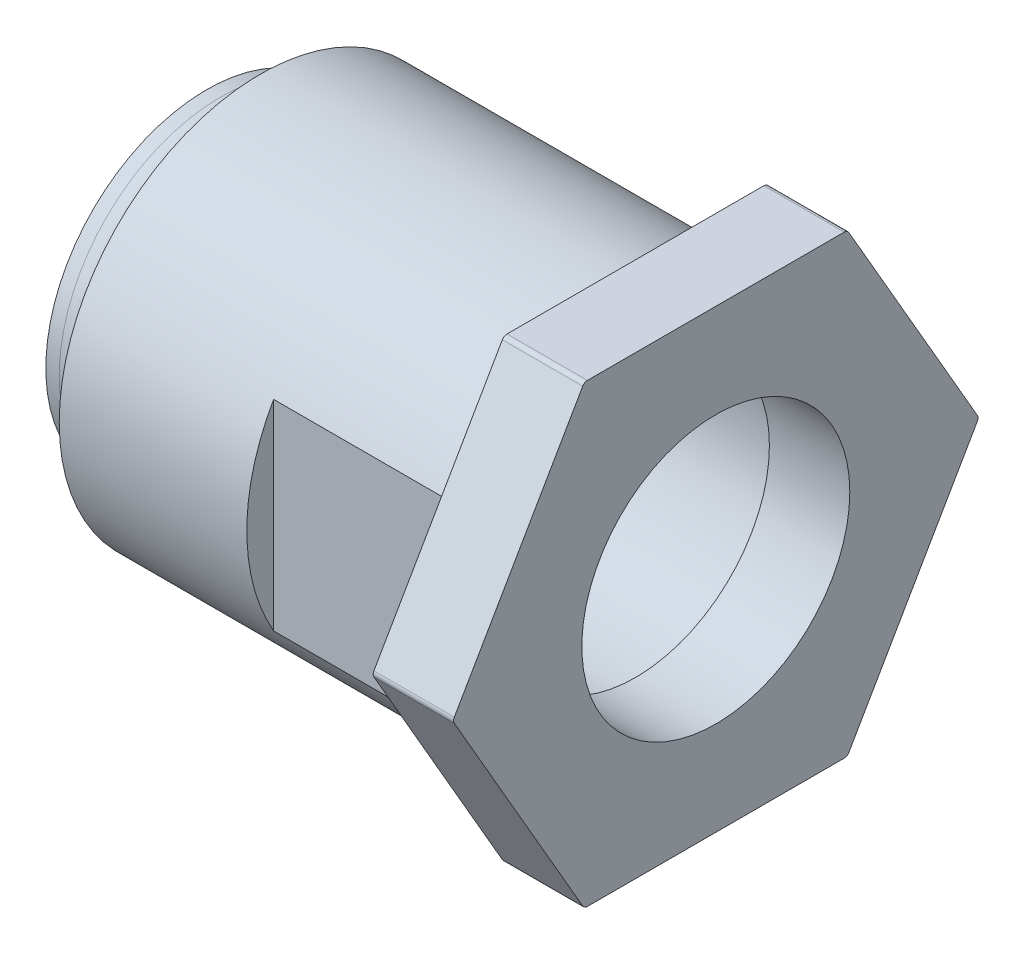
ISO-10303-21;
HEADER;
FILE_DESCRIPTION(('STEP AP214'),'2;1');
FILE_NAME('part.step','',(''),(''),'','','');
FILE_SCHEMA(('AUTOMOTIVE_DESIGN { 1 0 10303 214 1 1 1 1 }'));
ENDSEC;
DATA;
#1=APPLICATION_CONTEXT('core data for automotive mechanical design processes');
#2=APPLICATION_PROTOCOL_DEFINITION('international standard','automotive_design',2000,#1);
#3=PRODUCT_CONTEXT('',#1,'mechanical');
#4=PRODUCT('Part','Part','',(#3));
#5=PRODUCT_RELATED_PRODUCT_CATEGORY('part','',(#4));
#6=PRODUCT_DEFINITION_FORMATION('','',#4);
#7=PRODUCT_DEFINITION_CONTEXT('part definition',#1,'design');
#8=PRODUCT_DEFINITION('design','',#6,#7);
#9=PRODUCT_DEFINITION_SHAPE('','',#8);
#10=(LENGTH_UNIT() NAMED_UNIT(*) SI_UNIT(.MILLI.,.METRE.));
#11=(NAMED_UNIT(*) PLANE_ANGLE_UNIT() SI_UNIT($,.RADIAN.));
#12=(NAMED_UNIT(*) SI_UNIT($,.STERADIAN.) SOLID_ANGLE_UNIT());
#13=UNCERTAINTY_MEASURE_WITH_UNIT(LENGTH_MEASURE(1.E-05),#10,'distance_accuracy_value','');
#14=(GEOMETRIC_REPRESENTATION_CONTEXT(3) GLOBAL_UNCERTAINTY_ASSIGNED_CONTEXT((#13)) GLOBAL_UNIT_ASSIGNED_CONTEXT((#10,
#11,#12)) REPRESENTATION_CONTEXT('',''));
#15=CARTESIAN_POINT('',(0.,0.,0.));
#16=DIRECTION('',(0.,0.,1.));
#17=DIRECTION('',(1.,0.,0.));
#18=AXIS2_PLACEMENT_3D('',#15,#16,#17);
#19=CARTESIAN_POINT('',(0.,0.,0.));
#20=DIRECTION('',(1.,0.,0.));
#21=DIRECTION('',(0.,0.,-1.));
#22=AXIS2_PLACEMENT_3D('',#19,#20,#21);
#23=CYLINDRICAL_SURFACE('',#22,7.5);
#24=CARTESIAN_POINT('',(-14.,0.,0.));
#25=DIRECTION('',(1.,0.,0.));
#26=DIRECTION('',(0.,0.,-1.));
#27=AXIS2_PLACEMENT_3D('',#24,#25,#26);
#28=CIRCLE('',#27,7.5);
#29=CARTESIAN_POINT('',(-14.,0.,-7.5));
#30=VERTEX_POINT('',#29);
#31=EDGE_CURVE('E169',#30,#30,#28,.T.);
#32=ORIENTED_EDGE('',*,*,#31,.T.);
#33=EDGE_LOOP('',(#32));
#34=FACE_BOUND('',#33,.T.);
#35=CARTESIAN_POINT('',(0.,0.,0.));
#36=DIRECTION('',(1.,0.,0.));
#37=DIRECTION('',(0.,0.,-1.));
#38=AXIS2_PLACEMENT_3D('',#35,#36,#37);
#39=CIRCLE('',#38,7.5);
#40=CARTESIAN_POINT('',(0.,3.74165738677394,-6.5));
#41=VERTEX_POINT('',#40);
#42=CARTESIAN_POINT('',(0.,3.74165738677394,6.5));
#43=VERTEX_POINT('',#42);
#44=EDGE_CURVE('E168',#41,#43,#39,.T.);
#45=ORIENTED_EDGE('',*,*,#44,.F.);
#46=DIRECTION('',(1.,0.,0.));
#47=VECTOR('',#46,1.);
#48=CARTESIAN_POINT('',(0.,3.74165738677394,-6.5));
#49=LINE('',#48,#47);
#50=CARTESIAN_POINT('',(-7.,3.74165738677394,-6.5));
#51=VERTEX_POINT('',#50);
#52=EDGE_CURVE('E210',#41,#51,#49,.F.);
#53=ORIENTED_EDGE('',*,*,#52,.T.);
#54=CARTESIAN_POINT('',(-7.,0.,0.));
#55=DIRECTION('',(1.,0.,0.));
#56=DIRECTION('',(0.,0.,-1.));
#57=AXIS2_PLACEMENT_3D('',#54,#55,#56);
#58=CIRCLE('',#57,7.5);
#59=CARTESIAN_POINT('',(-7.,-3.74165738677394,-6.5));
#60=VERTEX_POINT('',#59);
#61=EDGE_CURVE('E207',#51,#60,#58,.F.);
#62=ORIENTED_EDGE('',*,*,#61,.T.);
#63=DIRECTION('',(1.,0.,0.));
#64=VECTOR('',#63,1.);
#65=CARTESIAN_POINT('',(0.,-3.74165738677394,-6.5));
#66=LINE('',#65,#64);
#67=CARTESIAN_POINT('',(0.,-3.74165738677394,-6.5));
#68=VERTEX_POINT('',#67);
#69=EDGE_CURVE('E164',#60,#68,#66,.T.);
#70=ORIENTED_EDGE('',*,*,#69,.T.);
#71=CARTESIAN_POINT('',(0.,-3.74165738677394,6.5));
#72=VERTEX_POINT('',#71);
#73=EDGE_CURVE('E158',#72,#68,#39,.T.);
#74=ORIENTED_EDGE('',*,*,#73,.F.);
#75=DIRECTION('',(1.,0.,0.));
#76=VECTOR('',#75,1.);
#77=CARTESIAN_POINT('',(0.,-3.74165738677394,6.5));
#78=LINE('',#77,#76);
#79=CARTESIAN_POINT('',(-7.,-3.74165738677394,6.5));
#80=VERTEX_POINT('',#79);
#81=EDGE_CURVE('E162',#72,#80,#78,.F.);
#82=ORIENTED_EDGE('',*,*,#81,.T.);
#83=CARTESIAN_POINT('',(-7.,3.74165738677394,6.5));
#84=VERTEX_POINT('',#83);
#85=EDGE_CURVE('E178',#80,#84,#58,.F.);
#86=ORIENTED_EDGE('',*,*,#85,.T.);
#87=DIRECTION('',(1.,0.,0.));
#88=VECTOR('',#87,1.);
#89=CARTESIAN_POINT('',(0.,3.74165738677394,6.5));
#90=LINE('',#89,#88);
#91=EDGE_CURVE('E205',#84,#43,#90,.T.);
#92=ORIENTED_EDGE('',*,*,#91,.T.);
#93=EDGE_LOOP('',(#45,#53,#62,#70,#74,#82,#86,#92));
#94=FACE_BOUND('',#93,.T.);
#95=ADVANCED_FACE('F42',(#34,#94),#23,.T.);
#96=CARTESIAN_POINT('',(-15.5,0.,0.));
#97=DIRECTION('',(1.,0.,0.));
#98=DIRECTION('',(0.,0.,-1.));
#99=AXIS2_PLACEMENT_3D('',#96,#97,#98);
#100=TOROIDAL_SURFACE('',#99,7.5,1.5);
#101=CARTESIAN_POINT('',(-15.5,0.,0.));
#102=DIRECTION('',(1.,0.,0.));
#103=DIRECTION('',(0.,0.,-1.));
#104=AXIS2_PLACEMENT_3D('',#101,#102,#103);
#105=CIRCLE('',#104,6.);
#106=CARTESIAN_POINT('',(-15.5,0.,-6.));
#107=VERTEX_POINT('',#106);
#108=EDGE_CURVE('E200',#107,#107,#105,.T.);
#109=ORIENTED_EDGE('',*,*,#108,.T.);
#110=EDGE_LOOP('',(#109));
#111=FACE_BOUND('',#110,.T.);
#112=ORIENTED_EDGE('',*,*,#31,.F.);
#113=EDGE_LOOP('',(#112));
#114=FACE_BOUND('',#113,.T.);
#115=ADVANCED_FACE('F347',(#111,#114),#100,.F.);
#116=CARTESIAN_POINT('',(0.,0.,0.));
#117=DIRECTION('',(1.,0.,0.));
#118=DIRECTION('',(0.,0.,-1.));
#119=AXIS2_PLACEMENT_3D('',#116,#117,#118);
#120=CYLINDRICAL_SURFACE('',#119,6.);
#121=CARTESIAN_POINT('',(-16.,0.,0.));
#122=DIRECTION('',(1.,0.,0.));
#123=DIRECTION('',(0.,0.,-1.));
#124=AXIS2_PLACEMENT_3D('',#121,#122,#123);
#125=CIRCLE('',#124,6.);
#126=CARTESIAN_POINT('',(-16.,0.,-6.));
#127=VERTEX_POINT('',#126);
#128=EDGE_CURVE('E197',#127,#127,#125,.T.);
#129=ORIENTED_EDGE('',*,*,#128,.T.);
#130=EDGE_LOOP('',(#129));
#131=FACE_BOUND('',#130,.T.);
#132=ORIENTED_EDGE('',*,*,#108,.F.);
#133=EDGE_LOOP('',(#132));
#134=FACE_BOUND('',#133,.T.);
#135=ADVANCED_FACE('F355',(#131,#134),#120,.T.);
#136=CARTESIAN_POINT('',(-16.,5.5,0.));
#137=DIRECTION('',(-1.,0.,0.));
#138=DIRECTION('',(0.,0.,1.));
#139=AXIS2_PLACEMENT_3D('',#136,#137,#138);
#140=PLANE('',#139);
#141=CARTESIAN_POINT('',(-16.,0.,0.));
#142=DIRECTION('',(1.,0.,0.));
#143=DIRECTION('',(0.,0.,-1.));
#144=AXIS2_PLACEMENT_3D('',#141,#142,#143);
#145=CIRCLE('',#144,5.5);
#146=CARTESIAN_POINT('',(-16.,0.,-5.5));
#147=VERTEX_POINT('',#146);
#148=EDGE_CURVE('E194',#147,#147,#145,.T.);
#149=ORIENTED_EDGE('',*,*,#148,.T.);
#150=EDGE_LOOP('',(#149));
#151=FACE_BOUND('',#150,.T.);
#152=ORIENTED_EDGE('',*,*,#128,.F.);
#153=EDGE_LOOP('',(#152));
#154=FACE_BOUND('',#153,.T.);
#155=ADVANCED_FACE('F402',(#151,#154),#140,.T.);
#156=CARTESIAN_POINT('',(0.,0.,0.));
#157=DIRECTION('',(1.,0.,0.));
#158=DIRECTION('',(0.,0.,-1.));
#159=AXIS2_PLACEMENT_3D('',#156,#157,#158);
#160=CYLINDRICAL_SURFACE('',#159,5.5);
#161=CARTESIAN_POINT('',(0.,0.,0.));
#162=DIRECTION('',(1.,0.,0.));
#163=DIRECTION('',(0.,0.,-1.));
#164=AXIS2_PLACEMENT_3D('',#161,#162,#163);
#165=CIRCLE('',#164,5.5);
#166=CARTESIAN_POINT('',(0.,0.,-5.5));
#167=VERTEX_POINT('',#166);
#168=EDGE_CURVE('E187',#167,#167,#165,.T.);
#169=ORIENTED_EDGE('',*,*,#168,.T.);
#170=EDGE_LOOP('',(#169));
#171=FACE_BOUND('',#170,.T.);
#172=ORIENTED_EDGE('',*,*,#148,.F.);
#173=EDGE_LOOP('',(#172));
#174=FACE_BOUND('',#173,.T.);
#175=ADVANCED_FACE('F392',(#171,#174),#160,.F.);
#176=CARTESIAN_POINT('',(-7.,-8.5,6.5));
#177=DIRECTION('',(0.,0.,1.));
#178=DIRECTION('',(1.,0.,0.));
#179=AXIS2_PLACEMENT_3D('',#176,#177,#178);
#180=PLANE('',#179);
#181=DIRECTION('',(0.,-1.,0.));
#182=VECTOR('',#181,1.);
#183=CARTESIAN_POINT('',(0.,-8.5,6.5));
#184=LINE('',#183,#182);
#185=EDGE_CURVE('E174',#43,#72,#184,.T.);
#186=ORIENTED_EDGE('',*,*,#185,.F.);
#187=ORIENTED_EDGE('',*,*,#91,.F.);
#188=DIRECTION('',(0.,-1.,0.));
#189=VECTOR('',#188,1.);
#190=CARTESIAN_POINT('',(-7.,-8.5,6.5));
#191=LINE('',#190,#189);
#192=EDGE_CURVE('E177',#84,#80,#191,.T.);
#193=ORIENTED_EDGE('',*,*,#192,.T.);
#194=ORIENTED_EDGE('',*,*,#81,.F.);
#195=EDGE_LOOP('',(#186,#187,#193,#194));
#196=FACE_BOUND('',#195,.T.);
#197=ADVANCED_FACE('F173',(#196),#180,.T.);
#198=CARTESIAN_POINT('',(-7.,0.,0.));
#199=DIRECTION('',(1.,0.,0.));
#200=DIRECTION('',(0.,0.,-1.));
#201=AXIS2_PLACEMENT_3D('',#198,#199,#200);
#202=PLANE('',#201);
#203=ORIENTED_EDGE('',*,*,#192,.F.);
#204=ORIENTED_EDGE('',*,*,#85,.F.);
#205=EDGE_LOOP('',(#203,#204));
#206=FACE_BOUND('',#205,.T.);
#207=ADVANCED_FACE('F391',(#206),#202,.T.);
#208=DIRECTION('',(0.,1.,0.));
#209=VECTOR('',#208,1.);
#210=CARTESIAN_POINT('',(-7.,-8.5,-6.5));
#211=LINE('',#210,#209);
#212=EDGE_CURVE('E182',#60,#51,#211,.T.);
#213=ORIENTED_EDGE('',*,*,#212,.F.);
#214=ORIENTED_EDGE('',*,*,#61,.F.);
#215=EDGE_LOOP('',(#213,#214));
#216=FACE_BOUND('',#215,.T.);
#217=ADVANCED_FACE('F396',(#216),#202,.T.);
#218=CARTESIAN_POINT('',(-7.,-8.5,-6.5));
#219=DIRECTION('',(0.,0.,-1.));
#220=DIRECTION('',(-1.,0.,0.));
#221=AXIS2_PLACEMENT_3D('',#218,#219,#220);
#222=PLANE('',#221);
#223=DIRECTION('',(0.,1.,0.));
#224=VECTOR('',#223,1.);
#225=CARTESIAN_POINT('',(0.,-8.5,-6.5));
#226=LINE('',#225,#224);
#227=EDGE_CURVE('E183',#68,#41,#226,.T.);
#228=ORIENTED_EDGE('',*,*,#227,.F.);
#229=ORIENTED_EDGE('',*,*,#69,.F.);
#230=ORIENTED_EDGE('',*,*,#212,.T.);
#231=ORIENTED_EDGE('',*,*,#52,.F.);
#232=EDGE_LOOP('',(#228,#229,#230,#231));
#233=FACE_BOUND('',#232,.T.);
#234=ADVANCED_FACE('F393',(#233),#222,.T.);
#235=CARTESIAN_POINT('',(0.,0.,0.));
#236=DIRECTION('',(1.,0.,0.));
#237=DIRECTION('',(0.,0.,-1.));
#238=AXIS2_PLACEMENT_3D('',#235,#236,#237);
#239=PLANE('',#238);
#240=DIRECTION('',(0.,0.866025403784439,-0.5));
#241=VECTOR('',#240,1.);
#242=CARTESIAN_POINT('',(0.,-8.5,-4.90747728811182));
#243=LINE('',#242,#241);
#244=CARTESIAN_POINT('',(0.,-8.4,-4.96521231503079));
#245=VERTEX_POINT('',#244);
#246=CARTESIAN_POINT('',(0.,-0.100000000000001,-9.75721954930468));
#247=VERTEX_POINT('',#246);
#248=EDGE_CURVE('E296',#245,#247,#243,.T.);
#249=ORIENTED_EDGE('',*,*,#248,.F.);
#250=CARTESIAN_POINT('',(0.,-8.3,-4.7920072342739));
#251=DIRECTION('',(1.,0.,0.));
#252=DIRECTION('',(0.,0.,-1.));
#253=AXIS2_PLACEMENT_3D('',#250,#251,#252);
#254=CIRCLE('',#253,0.2);
#255=CARTESIAN_POINT('',(0.,-8.5,-4.7920072342739));
#256=VERTEX_POINT('',#255);
#257=EDGE_CURVE('E228',#245,#256,#254,.F.);
#258=ORIENTED_EDGE('',*,*,#257,.T.);
#259=DIRECTION('',(0.,0.,-1.));
#260=VECTOR('',#259,1.);
#261=CARTESIAN_POINT('',(0.,-8.5,4.90747728811182));
#262=LINE('',#261,#260);
#263=CARTESIAN_POINT('',(0.,-8.5,4.79200723427389));
#264=VERTEX_POINT('',#263);
#265=EDGE_CURVE('E301',#264,#256,#262,.T.);
#266=ORIENTED_EDGE('',*,*,#265,.F.);
#267=CARTESIAN_POINT('',(0.,-8.3,4.79200723427389));
#268=DIRECTION('',(1.,0.,0.));
#269=DIRECTION('',(0.,0.,-1.));
#270=AXIS2_PLACEMENT_3D('',#267,#268,#269);
#271=CIRCLE('',#270,0.2);
#272=CARTESIAN_POINT('',(0.,-8.4,4.96521231503078));
#273=VERTEX_POINT('',#272);
#274=EDGE_CURVE('E226',#264,#273,#271,.F.);
#275=ORIENTED_EDGE('',*,*,#274,.T.);
#276=DIRECTION('',(0.,-0.866025403784438,-0.5));
#277=VECTOR('',#276,1.);
#278=CARTESIAN_POINT('',(0.,0.,9.81495457622364));
#279=LINE('',#278,#277);
#280=CARTESIAN_POINT('',(0.,-0.0999999999999984,9.75721954930468));
#281=VERTEX_POINT('',#280);
#282=EDGE_CURVE('E294',#281,#273,#279,.T.);
#283=ORIENTED_EDGE('',*,*,#282,.F.);
#284=CARTESIAN_POINT('',(0.,0.,9.58401446854779));
#285=DIRECTION('',(1.,0.,0.));
#286=DIRECTION('',(0.,0.,-1.));
#287=AXIS2_PLACEMENT_3D('',#284,#285,#286);
#288=CIRCLE('',#287,0.2);
#289=CARTESIAN_POINT('',(0.,0.100000000000001,9.75721954930468));
#290=VERTEX_POINT('',#289);
#291=EDGE_CURVE('E224',#281,#290,#288,.F.);
#292=ORIENTED_EDGE('',*,*,#291,.T.);
#293=DIRECTION('',(0.,-0.866025403784439,0.5));
#294=VECTOR('',#293,1.);
#295=CARTESIAN_POINT('',(0.,8.5,4.90747728811182));
#296=LINE('',#295,#294);
#297=CARTESIAN_POINT('',(0.,8.4,4.96521231503078));
#298=VERTEX_POINT('',#297);
#299=EDGE_CURVE('E291',#298,#290,#296,.T.);
#300=ORIENTED_EDGE('',*,*,#299,.F.);
#301=CARTESIAN_POINT('',(0.,8.3,4.79200723427389));
#302=DIRECTION('',(1.,0.,0.));
#303=DIRECTION('',(0.,0.,-1.));
#304=AXIS2_PLACEMENT_3D('',#301,#302,#303);
#305=CIRCLE('',#304,0.2);
#306=CARTESIAN_POINT('',(0.,8.5,4.7920072342739));
#307=VERTEX_POINT('',#306);
#308=EDGE_CURVE('E222',#298,#307,#305,.F.);
#309=ORIENTED_EDGE('',*,*,#308,.T.);
#310=DIRECTION('',(0.,0.,1.));
#311=VECTOR('',#310,1.);
#312=CARTESIAN_POINT('',(0.,8.5,-4.90747728811182));
#313=LINE('',#312,#311);
#314=CARTESIAN_POINT('',(0.,8.5,-4.79200723427389));
#315=VERTEX_POINT('',#314);
#316=EDGE_CURVE('E286',#315,#307,#313,.T.);
#317=ORIENTED_EDGE('',*,*,#316,.F.);
#318=CARTESIAN_POINT('',(0.,8.3,-4.79200723427389));
#319=DIRECTION('',(1.,0.,0.));
#320=DIRECTION('',(0.,0.,-1.));
#321=AXIS2_PLACEMENT_3D('',#318,#319,#320);
#322=CIRCLE('',#321,0.2);
#323=CARTESIAN_POINT('',(0.,8.4,-4.96521231503078));
#324=VERTEX_POINT('',#323);
#325=EDGE_CURVE('E218',#315,#324,#322,.F.);
#326=ORIENTED_EDGE('',*,*,#325,.T.);
#327=DIRECTION('',(0.,0.866025403784438,0.5));
#328=VECTOR('',#327,1.);
#329=CARTESIAN_POINT('',(0.,0.,-9.81495457622364));
#330=LINE('',#329,#328);
#331=CARTESIAN_POINT('',(0.,0.0999999999999985,-9.75721954930468));
#332=VERTEX_POINT('',#331);
#333=EDGE_CURVE('E268',#332,#324,#330,.T.);
#334=ORIENTED_EDGE('',*,*,#333,.F.);
#335=CARTESIAN_POINT('',(0.,0.,-9.58401446854779));
#336=DIRECTION('',(1.,0.,0.));
#337=DIRECTION('',(0.,0.,-1.));
#338=AXIS2_PLACEMENT_3D('',#335,#336,#337);
#339=CIRCLE('',#338,0.2);
#340=EDGE_CURVE('E220',#332,#247,#339,.F.);
#341=ORIENTED_EDGE('',*,*,#340,.T.);
#342=EDGE_LOOP('',(#249,#258,#266,#275,#283,#292,#300,#309,#317,#326,#334,#341));
#343=FACE_BOUND('',#342,.T.);
#344=ORIENTED_EDGE('',*,*,#185,.T.);
#345=ORIENTED_EDGE('',*,*,#73,.T.);
#346=ORIENTED_EDGE('',*,*,#227,.T.);
#347=ORIENTED_EDGE('',*,*,#44,.T.);
#348=EDGE_LOOP('',(#344,#345,#346,#347));
#349=FACE_BOUND('',#348,.T.);
#350=ADVANCED_FACE('F181',(#343,#349),#239,.F.);
#351=CARTESIAN_POINT('',(3.,0.,0.));
#352=DIRECTION('',(1.,0.,0.));
#353=DIRECTION('',(0.,0.,-1.));
#354=AXIS2_PLACEMENT_3D('',#351,#352,#353);
#355=PLANE('',#354);
#356=DIRECTION('',(0.,0.,-1.));
#357=VECTOR('',#356,1.);
#358=CARTESIAN_POINT('',(3.,-8.5,4.90747728811182));
#359=LINE('',#358,#357);
#360=CARTESIAN_POINT('',(3.,-8.5,4.79200723427389));
#361=VERTEX_POINT('',#360);
#362=CARTESIAN_POINT('',(3.,-8.5,-4.7920072342739));
#363=VERTEX_POINT('',#362);
#364=EDGE_CURVE('E193',#361,#363,#359,.T.);
#365=ORIENTED_EDGE('',*,*,#364,.T.);
#366=CARTESIAN_POINT('',(3.,-8.3,-4.7920072342739));
#367=DIRECTION('',(1.,0.,0.));
#368=DIRECTION('',(0.,0.,-1.));
#369=AXIS2_PLACEMENT_3D('',#366,#367,#368);
#370=CIRCLE('',#369,0.2);
#371=CARTESIAN_POINT('',(3.,-8.4,-4.96521231503079));
#372=VERTEX_POINT('',#371);
#373=EDGE_CURVE('E244',#363,#372,#370,.T.);
#374=ORIENTED_EDGE('',*,*,#373,.T.);
#375=DIRECTION('',(0.,0.866025403784439,-0.5));
#376=VECTOR('',#375,1.);
#377=CARTESIAN_POINT('',(3.,-8.5,-4.90747728811182));
#378=LINE('',#377,#376);
#379=CARTESIAN_POINT('',(3.,-0.100000000000001,-9.75721954930468));
#380=VERTEX_POINT('',#379);
#381=EDGE_CURVE('E279',#372,#380,#378,.T.);
#382=ORIENTED_EDGE('',*,*,#381,.T.);
#383=CARTESIAN_POINT('',(3.,0.,-9.58401446854779));
#384=DIRECTION('',(1.,0.,0.));
#385=DIRECTION('',(0.,0.,-1.));
#386=AXIS2_PLACEMENT_3D('',#383,#384,#385);
#387=CIRCLE('',#386,0.2);
#388=CARTESIAN_POINT('',(3.,0.0999999999999985,-9.75721954930468));
#389=VERTEX_POINT('',#388);
#390=EDGE_CURVE('E237',#380,#389,#387,.T.);
#391=ORIENTED_EDGE('',*,*,#390,.T.);
#392=DIRECTION('',(0.,0.866025403784438,0.5));
#393=VECTOR('',#392,1.);
#394=CARTESIAN_POINT('',(3.,0.,-9.81495457622364));
#395=LINE('',#394,#393);
#396=CARTESIAN_POINT('',(3.,8.4,-4.96521231503078));
#397=VERTEX_POINT('',#396);
#398=EDGE_CURVE('E265',#389,#397,#395,.T.);
#399=ORIENTED_EDGE('',*,*,#398,.T.);
#400=CARTESIAN_POINT('',(3.,8.3,-4.79200723427389));
#401=DIRECTION('',(1.,0.,0.));
#402=DIRECTION('',(0.,0.,-1.));
#403=AXIS2_PLACEMENT_3D('',#400,#401,#402);
#404=CIRCLE('',#403,0.2);
#405=CARTESIAN_POINT('',(3.,8.5,-4.79200723427389));
#406=VERTEX_POINT('',#405);
#407=EDGE_CURVE('E235',#397,#406,#404,.T.);
#408=ORIENTED_EDGE('',*,*,#407,.T.);
#409=DIRECTION('',(0.,0.,1.));
#410=VECTOR('',#409,1.);
#411=CARTESIAN_POINT('',(3.,8.5,-4.90747728811182));
#412=LINE('',#411,#410);
#413=CARTESIAN_POINT('',(3.,8.5,4.7920072342739));
#414=VERTEX_POINT('',#413);
#415=EDGE_CURVE('E278',#406,#414,#412,.T.);
#416=ORIENTED_EDGE('',*,*,#415,.T.);
#417=CARTESIAN_POINT('',(3.,8.3,4.79200723427389));
#418=DIRECTION('',(1.,0.,0.));
#419=DIRECTION('',(0.,0.,-1.));
#420=AXIS2_PLACEMENT_3D('',#417,#418,#419);
#421=CIRCLE('',#420,0.2);
#422=CARTESIAN_POINT('',(3.,8.4,4.96521231503078));
#423=VERTEX_POINT('',#422);
#424=EDGE_CURVE('E239',#414,#423,#421,.T.);
#425=ORIENTED_EDGE('',*,*,#424,.T.);
#426=DIRECTION('',(0.,-0.866025403784439,0.5));
#427=VECTOR('',#426,1.);
#428=CARTESIAN_POINT('',(3.,8.5,4.90747728811182));
#429=LINE('',#428,#427);
#430=CARTESIAN_POINT('',(3.,0.100000000000001,9.75721954930468));
#431=VERTEX_POINT('',#430);
#432=EDGE_CURVE('E313',#423,#431,#429,.T.);
#433=ORIENTED_EDGE('',*,*,#432,.T.);
#434=CARTESIAN_POINT('',(3.,0.,9.58401446854779));
#435=DIRECTION('',(1.,0.,0.));
#436=DIRECTION('',(0.,0.,-1.));
#437=AXIS2_PLACEMENT_3D('',#434,#435,#436);
#438=CIRCLE('',#437,0.2);
#439=CARTESIAN_POINT('',(3.,-0.0999999999999984,9.75721954930468));
#440=VERTEX_POINT('',#439);
#441=EDGE_CURVE('E64',#431,#440,#438,.T.);
#442=ORIENTED_EDGE('',*,*,#441,.T.);
#443=DIRECTION('',(0.,-0.866025403784438,-0.5));
#444=VECTOR('',#443,1.);
#445=CARTESIAN_POINT('',(3.,0.,9.81495457622364));
#446=LINE('',#445,#444);
#447=CARTESIAN_POINT('',(3.,-8.4,4.96521231503078));
#448=VERTEX_POINT('',#447);
#449=EDGE_CURVE('E315',#440,#448,#446,.T.);
#450=ORIENTED_EDGE('',*,*,#449,.T.);
#451=CARTESIAN_POINT('',(3.,-8.3,4.79200723427389));
#452=DIRECTION('',(1.,0.,0.));
#453=DIRECTION('',(0.,0.,-1.));
#454=AXIS2_PLACEMENT_3D('',#451,#452,#453);
#455=CIRCLE('',#454,0.2);
#456=EDGE_CURVE('E242',#448,#361,#455,.T.);
#457=ORIENTED_EDGE('',*,*,#456,.T.);
#458=EDGE_LOOP('',(#365,#374,#382,#391,#399,#408,#416,#425,#433,#442,#450,#457));
#459=FACE_BOUND('',#458,.T.);
#460=CARTESIAN_POINT('',(3.,0.,0.));
#461=DIRECTION('',(1.,0.,0.));
#462=DIRECTION('',(0.,0.,-1.));
#463=AXIS2_PLACEMENT_3D('',#460,#461,#462);
#464=CIRCLE('',#463,5.);
#465=CARTESIAN_POINT('',(3.,0.,-5.));
#466=VERTEX_POINT('',#465);
#467=EDGE_CURVE('E318',#466,#466,#464,.T.);
#468=ORIENTED_EDGE('',*,*,#467,.F.);
#469=EDGE_LOOP('',(#468));
#470=FACE_BOUND('',#469,.T.);
#471=ADVANCED_FACE('F272',(#459,#470),#355,.T.);
#472=ORIENTED_EDGE('',*,*,#168,.F.);
#473=EDGE_LOOP('',(#472));
#474=FACE_BOUND('',#473,.T.);
#475=CARTESIAN_POINT('',(0.,0.,0.));
#476=DIRECTION('',(1.,0.,0.));
#477=DIRECTION('',(0.,0.,-1.));
#478=AXIS2_PLACEMENT_3D('',#475,#476,#477);
#479=CIRCLE('',#478,5.);
#480=CARTESIAN_POINT('',(0.,0.,-5.));
#481=VERTEX_POINT('',#480);
#482=EDGE_CURVE('E309',#481,#481,#479,.T.);
#483=ORIENTED_EDGE('',*,*,#482,.T.);
#484=EDGE_LOOP('',(#483));
#485=FACE_BOUND('',#484,.T.);
#486=ADVANCED_FACE('F327',(#474,#485),#239,.F.);
#487=CARTESIAN_POINT('',(3.,-8.5,-4.90747728811182));
#488=DIRECTION('',(0.,0.5,0.866025403784439));
#489=DIRECTION('',(0.,-0.866025403784439,0.5));
#490=AXIS2_PLACEMENT_3D('',#487,#488,#489);
#491=PLANE('',#490);
#492=ORIENTED_EDGE('',*,*,#381,.F.);
#493=DIRECTION('',(-1.,0.,0.));
#494=VECTOR('',#493,1.);
#495=CARTESIAN_POINT('',(3.,-8.4,-4.96521231503079));
#496=LINE('',#495,#494);
#497=EDGE_CURVE('E215',#372,#245,#496,.T.);
#498=ORIENTED_EDGE('',*,*,#497,.T.);
#499=ORIENTED_EDGE('',*,*,#248,.T.);
#500=DIRECTION('',(-1.,0.,0.));
#501=VECTOR('',#500,1.);
#502=CARTESIAN_POINT('',(3.,-0.100000000000001,-9.75721954930468));
#503=LINE('',#502,#501);
#504=EDGE_CURVE('E213',#247,#380,#503,.F.);
#505=ORIENTED_EDGE('',*,*,#504,.T.);
#506=EDGE_LOOP('',(#492,#498,#499,#505));
#507=FACE_BOUND('',#506,.T.);
#508=ADVANCED_FACE('F378',(#507),#491,.F.);
#509=CARTESIAN_POINT('',(3.,0.,-9.81495457622364));
#510=DIRECTION('',(0.,-0.5,0.866025403784438));
#511=DIRECTION('',(0.,-0.866025403784439,-0.5));
#512=AXIS2_PLACEMENT_3D('',#509,#510,#511);
#513=PLANE('',#512);
#514=ORIENTED_EDGE('',*,*,#398,.F.);
#515=DIRECTION('',(-1.,0.,0.));
#516=VECTOR('',#515,1.);
#517=CARTESIAN_POINT('',(3.,0.0999999999999986,-9.75721954930468));
#518=LINE('',#517,#516);
#519=EDGE_CURVE('E12',#389,#332,#518,.T.);
#520=ORIENTED_EDGE('',*,*,#519,.T.);
#521=ORIENTED_EDGE('',*,*,#333,.T.);
#522=DIRECTION('',(-1.,0.,0.));
#523=VECTOR('',#522,1.);
#524=CARTESIAN_POINT('',(3.,8.4,-4.96521231503078));
#525=LINE('',#524,#523);
#526=EDGE_CURVE('E50',#324,#397,#525,.F.);
#527=ORIENTED_EDGE('',*,*,#526,.T.);
#528=EDGE_LOOP('',(#514,#520,#521,#527));
#529=FACE_BOUND('',#528,.T.);
#530=ADVANCED_FACE('F264',(#529),#513,.F.);
#531=CARTESIAN_POINT('',(3.,8.5,-4.90747728811182));
#532=DIRECTION('',(0.,-1.,0.));
#533=DIRECTION('',(0.,0.,-1.));
#534=AXIS2_PLACEMENT_3D('',#531,#532,#533);
#535=PLANE('',#534);
#536=ORIENTED_EDGE('',*,*,#316,.T.);
#537=DIRECTION('',(-1.,0.,0.));
#538=VECTOR('',#537,1.);
#539=CARTESIAN_POINT('',(3.,8.5,4.7920072342739));
#540=LINE('',#539,#538);
#541=EDGE_CURVE('E258',#307,#414,#540,.F.);
#542=ORIENTED_EDGE('',*,*,#541,.T.);
#543=ORIENTED_EDGE('',*,*,#415,.F.);
#544=DIRECTION('',(-1.,0.,0.));
#545=VECTOR('',#544,1.);
#546=CARTESIAN_POINT('',(3.,8.5,-4.79200723427389));
#547=LINE('',#546,#545);
#548=EDGE_CURVE('E255',#406,#315,#547,.T.);
#549=ORIENTED_EDGE('',*,*,#548,.T.);
#550=EDGE_LOOP('',(#536,#542,#543,#549));
#551=FACE_BOUND('',#550,.T.);
#552=ADVANCED_FACE('F285',(#551),#535,.F.);
#553=CARTESIAN_POINT('',(3.,8.5,4.90747728811182));
#554=DIRECTION('',(0.,-0.5,-0.866025403784438));
#555=DIRECTION('',(0.,0.866025403784439,-0.5));
#556=AXIS2_PLACEMENT_3D('',#553,#554,#555);
#557=PLANE('',#556);
#558=ORIENTED_EDGE('',*,*,#299,.T.);
#559=DIRECTION('',(-1.,0.,0.));
#560=VECTOR('',#559,1.);
#561=CARTESIAN_POINT('',(3.,0.100000000000003,9.75721954930468));
#562=LINE('',#561,#560);
#563=EDGE_CURVE('E253',#290,#431,#562,.F.);
#564=ORIENTED_EDGE('',*,*,#563,.T.);
#565=ORIENTED_EDGE('',*,*,#432,.F.);
#566=DIRECTION('',(-1.,0.,0.));
#567=VECTOR('',#566,1.);
#568=CARTESIAN_POINT('',(3.,8.4,4.96521231503078));
#569=LINE('',#568,#567);
#570=EDGE_CURVE('E250',#423,#298,#569,.T.);
#571=ORIENTED_EDGE('',*,*,#570,.T.);
#572=EDGE_LOOP('',(#558,#564,#565,#571));
#573=FACE_BOUND('',#572,.T.);
#574=ADVANCED_FACE('F466',(#573),#557,.F.);
#575=CARTESIAN_POINT('',(3.,0.,9.81495457622364));
#576=DIRECTION('',(0.,0.5,-0.866025403784438));
#577=DIRECTION('',(0.,0.866025403784439,0.5));
#578=AXIS2_PLACEMENT_3D('',#575,#576,#577);
#579=PLANE('',#578);
#580=ORIENTED_EDGE('',*,*,#282,.T.);
#581=DIRECTION('',(-1.,0.,0.));
#582=VECTOR('',#581,1.);
#583=CARTESIAN_POINT('',(3.,-8.4,4.96521231503078));
#584=LINE('',#583,#582);
#585=EDGE_CURVE('E57',#273,#448,#584,.F.);
#586=ORIENTED_EDGE('',*,*,#585,.T.);
#587=ORIENTED_EDGE('',*,*,#449,.F.);
#588=DIRECTION('',(-1.,0.,0.));
#589=VECTOR('',#588,1.);
#590=CARTESIAN_POINT('',(3.,-0.0999999999999985,9.75721954930468));
#591=LINE('',#590,#589);
#592=EDGE_CURVE('E246',#440,#281,#591,.T.);
#593=ORIENTED_EDGE('',*,*,#592,.T.);
#594=EDGE_LOOP('',(#580,#586,#587,#593));
#595=FACE_BOUND('',#594,.T.);
#596=ADVANCED_FACE('F343',(#595),#579,.F.);
#597=CARTESIAN_POINT('',(3.,-8.5,4.90747728811182));
#598=DIRECTION('',(0.,1.,0.));
#599=DIRECTION('',(0.,0.,1.));
#600=AXIS2_PLACEMENT_3D('',#597,#598,#599);
#601=PLANE('',#600);
#602=ORIENTED_EDGE('',*,*,#265,.T.);
#603=DIRECTION('',(-1.,0.,0.));
#604=VECTOR('',#603,1.);
#605=CARTESIAN_POINT('',(3.,-8.5,-4.7920072342739));
#606=LINE('',#605,#604);
#607=EDGE_CURVE('E233',#256,#363,#606,.F.);
#608=ORIENTED_EDGE('',*,*,#607,.T.);
#609=ORIENTED_EDGE('',*,*,#364,.F.);
#610=DIRECTION('',(-1.,0.,0.));
#611=VECTOR('',#610,1.);
#612=CARTESIAN_POINT('',(3.,-8.5,4.79200723427389));
#613=LINE('',#612,#611);
#614=EDGE_CURVE('E230',#361,#264,#613,.T.);
#615=ORIENTED_EDGE('',*,*,#614,.T.);
#616=EDGE_LOOP('',(#602,#608,#609,#615));
#617=FACE_BOUND('',#616,.T.);
#618=ADVANCED_FACE('F332',(#617),#601,.F.);
#619=CARTESIAN_POINT('',(3.,0.,0.));
#620=DIRECTION('',(-1.,0.,0.));
#621=DIRECTION('',(0.,0.,1.));
#622=AXIS2_PLACEMENT_3D('',#619,#620,#621);
#623=CYLINDRICAL_SURFACE('',#622,5.);
#624=ORIENTED_EDGE('',*,*,#467,.T.);
#625=EDGE_LOOP('',(#624));
#626=FACE_BOUND('',#625,.T.);
#627=ORIENTED_EDGE('',*,*,#482,.F.);
#628=EDGE_LOOP('',(#627));
#629=FACE_BOUND('',#628,.T.);
#630=ADVANCED_FACE('F329',(#626,#629),#623,.F.);
#631=CARTESIAN_POINT('',(3.,-8.3,-4.7920072342739));
#632=DIRECTION('',(-1.,0.,0.));
#633=DIRECTION('',(0.,0.,1.));
#634=AXIS2_PLACEMENT_3D('',#631,#632,#633);
#635=CYLINDRICAL_SURFACE('',#634,0.2);
#636=ORIENTED_EDGE('',*,*,#373,.F.);
#637=ORIENTED_EDGE('',*,*,#607,.F.);
#638=ORIENTED_EDGE('',*,*,#257,.F.);
#639=ORIENTED_EDGE('',*,*,#497,.F.);
#640=EDGE_LOOP('',(#636,#637,#638,#639));
#641=FACE_BOUND('',#640,.T.);
#642=ADVANCED_FACE('F331',(#641),#635,.T.);
#643=CARTESIAN_POINT('',(3.,-8.3,4.79200723427389));
#644=DIRECTION('',(-1.,0.,0.));
#645=DIRECTION('',(0.,0.,1.));
#646=AXIS2_PLACEMENT_3D('',#643,#644,#645);
#647=CYLINDRICAL_SURFACE('',#646,0.2);
#648=ORIENTED_EDGE('',*,*,#456,.F.);
#649=ORIENTED_EDGE('',*,*,#585,.F.);
#650=ORIENTED_EDGE('',*,*,#274,.F.);
#651=ORIENTED_EDGE('',*,*,#614,.F.);
#652=EDGE_LOOP('',(#648,#649,#650,#651));
#653=FACE_BOUND('',#652,.T.);
#654=ADVANCED_FACE('F339',(#653),#647,.T.);
#655=CARTESIAN_POINT('',(3.,0.,9.58401446854779));
#656=DIRECTION('',(-1.,0.,0.));
#657=DIRECTION('',(0.,0.,1.));
#658=AXIS2_PLACEMENT_3D('',#655,#656,#657);
#659=CYLINDRICAL_SURFACE('',#658,0.2);
#660=ORIENTED_EDGE('',*,*,#441,.F.);
#661=ORIENTED_EDGE('',*,*,#563,.F.);
#662=ORIENTED_EDGE('',*,*,#291,.F.);
#663=ORIENTED_EDGE('',*,*,#592,.F.);
#664=EDGE_LOOP('',(#660,#661,#662,#663));
#665=FACE_BOUND('',#664,.T.);
#666=ADVANCED_FACE('F362',(#665),#659,.T.);
#667=CARTESIAN_POINT('',(3.,8.3,4.79200723427389));
#668=DIRECTION('',(-1.,0.,0.));
#669=DIRECTION('',(0.,0.,1.));
#670=AXIS2_PLACEMENT_3D('',#667,#668,#669);
#671=CYLINDRICAL_SURFACE('',#670,0.2);
#672=ORIENTED_EDGE('',*,*,#424,.F.);
#673=ORIENTED_EDGE('',*,*,#541,.F.);
#674=ORIENTED_EDGE('',*,*,#308,.F.);
#675=ORIENTED_EDGE('',*,*,#570,.F.);
#676=EDGE_LOOP('',(#672,#673,#674,#675));
#677=FACE_BOUND('',#676,.T.);
#678=ADVANCED_FACE('F366',(#677),#671,.T.);
#679=CARTESIAN_POINT('',(3.,0.,-9.58401446854779));
#680=DIRECTION('',(-1.,0.,0.));
#681=DIRECTION('',(0.,0.,1.));
#682=AXIS2_PLACEMENT_3D('',#679,#680,#681);
#683=CYLINDRICAL_SURFACE('',#682,0.2);
#684=ORIENTED_EDGE('',*,*,#390,.F.);
#685=ORIENTED_EDGE('',*,*,#504,.F.);
#686=ORIENTED_EDGE('',*,*,#340,.F.);
#687=ORIENTED_EDGE('',*,*,#519,.F.);
#688=EDGE_LOOP('',(#684,#685,#686,#687));
#689=FACE_BOUND('',#688,.T.);
#690=ADVANCED_FACE('F369',(#689),#683,.T.);
#691=CARTESIAN_POINT('',(3.,8.3,-4.79200723427389));
#692=DIRECTION('',(-1.,0.,0.));
#693=DIRECTION('',(0.,0.,1.));
#694=AXIS2_PLACEMENT_3D('',#691,#692,#693);
#695=CYLINDRICAL_SURFACE('',#694,0.2);
#696=ORIENTED_EDGE('',*,*,#407,.F.);
#697=ORIENTED_EDGE('',*,*,#526,.F.);
#698=ORIENTED_EDGE('',*,*,#325,.F.);
#699=ORIENTED_EDGE('',*,*,#548,.F.);
#700=EDGE_LOOP('',(#696,#697,#698,#699));
#701=FACE_BOUND('',#700,.T.);
#702=ADVANCED_FACE('F44',(#701),#695,.T.);
#703=CLOSED_SHELL('',(#95,#115,#135,#155,#175,#197,#207,#217,#234,#350,#471,#486,#508,#530,#552,
#574,#596,#618,#630,#642,#654,#666,#678,#690,#702));
#704=MANIFOLD_SOLID_BREP('B2',#703);
#705=ADVANCED_BREP_SHAPE_REPRESENTATION('',(#18,#704),#14);
#706=SHAPE_DEFINITION_REPRESENTATION(#9,#705);
ENDSEC;
END-ISO-10303-21;
